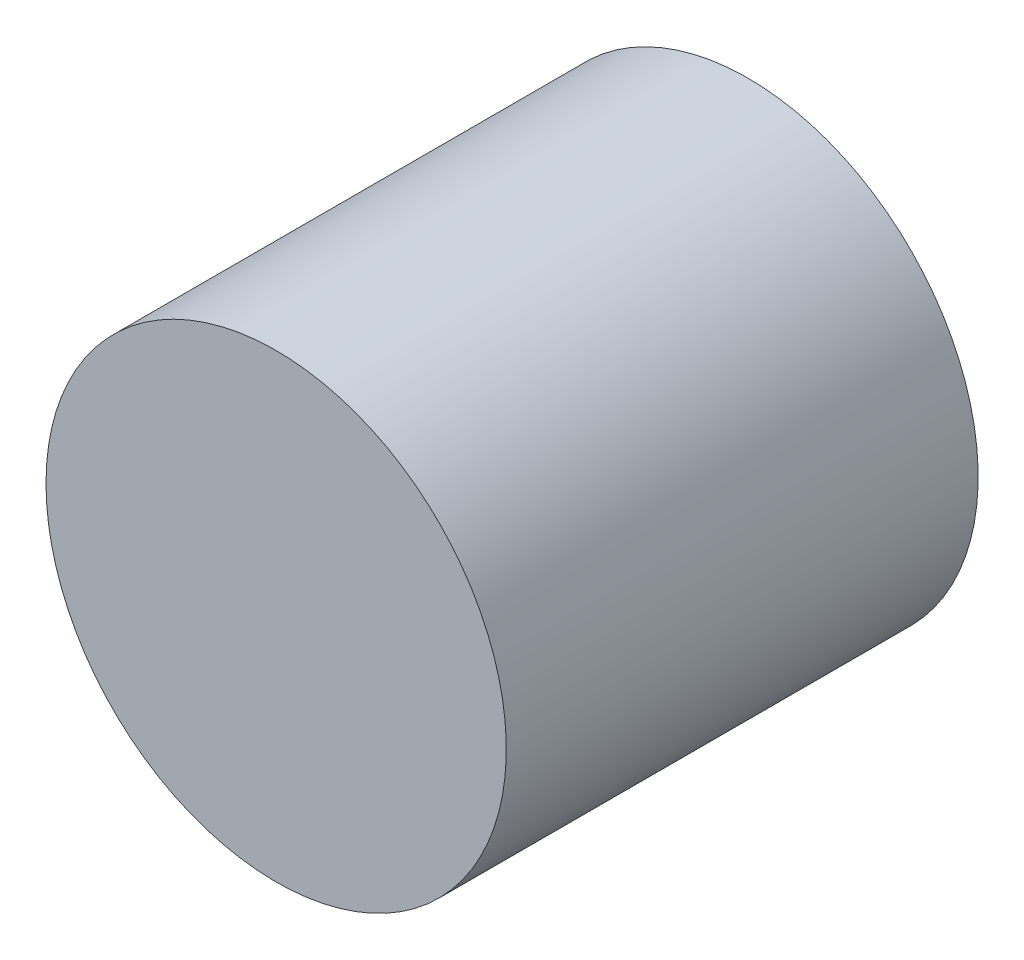
ISO-10303-21;
HEADER;
FILE_DESCRIPTION(('STEP AP214'),'2;1');
FILE_NAME('part.step','',(''),(''),'','','');
FILE_SCHEMA(('AUTOMOTIVE_DESIGN { 1 0 10303 214 1 1 1 1 }'));
ENDSEC;
DATA;
#1=APPLICATION_CONTEXT('core data for automotive mechanical design processes');
#2=APPLICATION_PROTOCOL_DEFINITION('international standard','automotive_design',2000,#1);
#3=PRODUCT_CONTEXT('',#1,'mechanical');
#4=PRODUCT('Part','Part','',(#3));
#5=PRODUCT_RELATED_PRODUCT_CATEGORY('part','',(#4));
#6=PRODUCT_DEFINITION_FORMATION('','',#4);
#7=PRODUCT_DEFINITION_CONTEXT('part definition',#1,'design');
#8=PRODUCT_DEFINITION('design','',#6,#7);
#9=PRODUCT_DEFINITION_SHAPE('','',#8);
#10=(LENGTH_UNIT() NAMED_UNIT(*) SI_UNIT(.MILLI.,.METRE.));
#11=(NAMED_UNIT(*) PLANE_ANGLE_UNIT() SI_UNIT($,.RADIAN.));
#12=(NAMED_UNIT(*) SI_UNIT($,.STERADIAN.) SOLID_ANGLE_UNIT());
#13=UNCERTAINTY_MEASURE_WITH_UNIT(LENGTH_MEASURE(1.E-05),#10,'distance_accuracy_value','');
#14=(GEOMETRIC_REPRESENTATION_CONTEXT(3) GLOBAL_UNCERTAINTY_ASSIGNED_CONTEXT((#13)) GLOBAL_UNIT_ASSIGNED_CONTEXT((#10,
#11,#12)) REPRESENTATION_CONTEXT('',''));
#15=CARTESIAN_POINT('',(0.,0.,0.));
#16=DIRECTION('',(0.,0.,1.));
#17=DIRECTION('',(1.,0.,0.));
#18=AXIS2_PLACEMENT_3D('',#15,#16,#17);
#19=CARTESIAN_POINT('',(2.00000108,0.,0.));
#20=DIRECTION('',(0.,0.,-1.));
#21=DIRECTION('',(-1.,0.,0.));
#22=AXIS2_PLACEMENT_3D('',#19,#20,#21);
#23=PLANE('',#22);
#24=CARTESIAN_POINT('',(0.,0.,0.));
#25=DIRECTION('',(0.,0.,-1.));
#26=DIRECTION('',(-1.,0.,0.));
#27=AXIS2_PLACEMENT_3D('',#24,#25,#26);
#28=CIRCLE('',#27,2.00000108);
#29=CARTESIAN_POINT('',(-2.00000108,0.,0.));
#30=VERTEX_POINT('',#29);
#31=EDGE_CURVE('E18',#30,#30,#28,.F.);
#32=ORIENTED_EDGE('',*,*,#31,.F.);
#33=EDGE_LOOP('',(#32));
#34=FACE_BOUND('',#33,.T.);
#35=ADVANCED_FACE('F15',(#34),#23,.T.);
#36=CARTESIAN_POINT('',(2.00000108,0.,4.09999942));
#37=DIRECTION('',(0.,0.,-1.));
#38=DIRECTION('',(-1.,0.,0.));
#39=AXIS2_PLACEMENT_3D('',#36,#37,#38);
#40=PLANE('',#39);
#41=CARTESIAN_POINT('',(0.,0.,4.09999942));
#42=DIRECTION('',(0.,0.,-1.));
#43=DIRECTION('',(-1.,0.,0.));
#44=AXIS2_PLACEMENT_3D('',#41,#42,#43);
#45=CIRCLE('',#44,2.00000108);
#46=CARTESIAN_POINT('',(-2.00000108,0.,4.09999942));
#47=VERTEX_POINT('',#46);
#48=EDGE_CURVE('E10',#47,#47,#45,.T.);
#49=ORIENTED_EDGE('',*,*,#48,.F.);
#50=EDGE_LOOP('',(#49));
#51=FACE_BOUND('',#50,.T.);
#52=ADVANCED_FACE('F30',(#51),#40,.F.);
#53=CARTESIAN_POINT('',(0.,0.,0.));
#54=DIRECTION('',(0.,0.,-1.));
#55=DIRECTION('',(-1.,0.,0.));
#56=AXIS2_PLACEMENT_3D('',#53,#54,#55);
#57=CYLINDRICAL_SURFACE('',#56,2.00000108);
#58=ORIENTED_EDGE('',*,*,#48,.T.);
#59=EDGE_LOOP('',(#58));
#60=FACE_BOUND('',#59,.T.);
#61=ORIENTED_EDGE('',*,*,#31,.T.);
#62=EDGE_LOOP('',(#61));
#63=FACE_BOUND('',#62,.T.);
#64=ADVANCED_FACE('F27',(#60,#63),#57,.T.);
#65=CLOSED_SHELL('',(#35,#52,#64));
#66=MANIFOLD_SOLID_BREP('B1',#65);
#67=ADVANCED_BREP_SHAPE_REPRESENTATION('',(#18,#66),#14);
#68=SHAPE_DEFINITION_REPRESENTATION(#9,#67);
ENDSEC;
END-ISO-10303-21;
